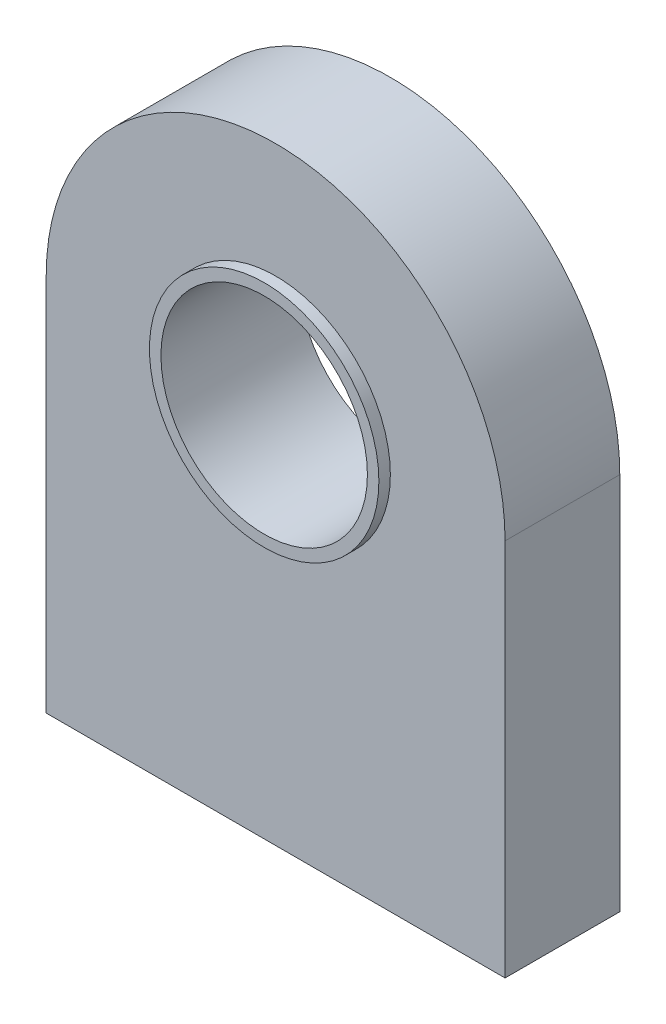
ISO-10303-21;
HEADER;
FILE_DESCRIPTION(('STEP AP214'),'2;1');
FILE_NAME('part.step','',(''),(''),'','','');
FILE_SCHEMA(('AUTOMOTIVE_DESIGN { 1 0 10303 214 1 1 1 1 }'));
ENDSEC;
DATA;
#1=APPLICATION_CONTEXT('core data for automotive mechanical design processes');
#2=APPLICATION_PROTOCOL_DEFINITION('international standard','automotive_design',2000,#1);
#3=PRODUCT_CONTEXT('',#1,'mechanical');
#4=PRODUCT('Part','Part','',(#3));
#5=PRODUCT_RELATED_PRODUCT_CATEGORY('part','',(#4));
#6=PRODUCT_DEFINITION_FORMATION('','',#4);
#7=PRODUCT_DEFINITION_CONTEXT('part definition',#1,'design');
#8=PRODUCT_DEFINITION('design','',#6,#7);
#9=PRODUCT_DEFINITION_SHAPE('','',#8);
#10=(LENGTH_UNIT() NAMED_UNIT(*) SI_UNIT(.MILLI.,.METRE.));
#11=(NAMED_UNIT(*) PLANE_ANGLE_UNIT() SI_UNIT($,.RADIAN.));
#12=(NAMED_UNIT(*) SI_UNIT($,.STERADIAN.) SOLID_ANGLE_UNIT());
#13=UNCERTAINTY_MEASURE_WITH_UNIT(LENGTH_MEASURE(1.E-05),#10,'distance_accuracy_value','');
#14=(GEOMETRIC_REPRESENTATION_CONTEXT(3) GLOBAL_UNCERTAINTY_ASSIGNED_CONTEXT((#13)) GLOBAL_UNIT_ASSIGNED_CONTEXT((#10,
#11,#12)) REPRESENTATION_CONTEXT('',''));
#15=CARTESIAN_POINT('',(0.,0.,0.));
#16=DIRECTION('',(0.,0.,1.));
#17=DIRECTION('',(1.,0.,0.));
#18=AXIS2_PLACEMENT_3D('',#15,#16,#17);
#19=CARTESIAN_POINT('',(10.,16.5,5.));
#20=DIRECTION('',(0.,0.,-1.));
#21=DIRECTION('',(-1.,0.,0.));
#22=AXIS2_PLACEMENT_3D('',#19,#20,#21);
#23=PLANE('',#22);
#24=CARTESIAN_POINT('',(10.,16.5,5.));
#25=DIRECTION('',(0.,0.,-1.));
#26=DIRECTION('',(-1.,0.,0.));
#27=AXIS2_PLACEMENT_3D('',#24,#25,#26);
#28=CIRCLE('',#27,5.);
#29=CARTESIAN_POINT('',(5.,16.5,5.));
#30=VERTEX_POINT('',#29);
#31=EDGE_CURVE('E117',#30,#30,#28,.T.);
#32=ORIENTED_EDGE('',*,*,#31,.T.);
#33=EDGE_LOOP('',(#32));
#34=FACE_BOUND('',#33,.T.);
#35=DIRECTION('',(1.,0.,0.));
#36=VECTOR('',#35,1.);
#37=CARTESIAN_POINT('',(20.,0.,5.));
#38=LINE('',#37,#36);
#39=CARTESIAN_POINT('',(0.,0.,5.));
#40=VERTEX_POINT('',#39);
#41=CARTESIAN_POINT('',(20.,0.,5.));
#42=VERTEX_POINT('',#41);
#43=EDGE_CURVE('E95',#40,#42,#38,.T.);
#44=ORIENTED_EDGE('',*,*,#43,.T.);
#45=DIRECTION('',(0.,1.,0.));
#46=VECTOR('',#45,1.);
#47=CARTESIAN_POINT('',(20.,16.5,5.));
#48=LINE('',#47,#46);
#49=CARTESIAN_POINT('',(20.,16.5,5.));
#50=VERTEX_POINT('',#49);
#51=EDGE_CURVE('E91',#42,#50,#48,.T.);
#52=ORIENTED_EDGE('',*,*,#51,.T.);
#53=CARTESIAN_POINT('',(10.,16.5,5.));
#54=DIRECTION('',(0.,0.,1.));
#55=DIRECTION('',(-1.,0.,0.));
#56=AXIS2_PLACEMENT_3D('',#53,#54,#55);
#57=CIRCLE('',#56,10.);
#58=CARTESIAN_POINT('',(0.,16.5,5.));
#59=VERTEX_POINT('',#58);
#60=EDGE_CURVE('E93',#50,#59,#57,.T.);
#61=ORIENTED_EDGE('',*,*,#60,.T.);
#62=DIRECTION('',(0.,-1.,0.));
#63=VECTOR('',#62,1.);
#64=CARTESIAN_POINT('',(0.,0.,5.));
#65=LINE('',#64,#63);
#66=EDGE_CURVE('E60',#59,#40,#65,.T.);
#67=ORIENTED_EDGE('',*,*,#66,.T.);
#68=EDGE_LOOP('',(#44,#52,#61,#67));
#69=FACE_BOUND('',#68,.T.);
#70=ADVANCED_FACE('F42',(#34,#69),#23,.F.);
#71=CARTESIAN_POINT('',(10.,16.5,0.));
#72=DIRECTION('',(0.,0.,-1.));
#73=DIRECTION('',(-1.,0.,0.));
#74=AXIS2_PLACEMENT_3D('',#71,#72,#73);
#75=PLANE('',#74);
#76=CARTESIAN_POINT('',(10.,16.5,0.));
#77=DIRECTION('',(0.,0.,-1.));
#78=DIRECTION('',(-1.,0.,0.));
#79=AXIS2_PLACEMENT_3D('',#76,#77,#78);
#80=CIRCLE('',#79,5.);
#81=CARTESIAN_POINT('',(5.,16.5,0.));
#82=VERTEX_POINT('',#81);
#83=EDGE_CURVE('E11',#82,#82,#80,.T.);
#84=ORIENTED_EDGE('',*,*,#83,.F.);
#85=EDGE_LOOP('',(#84));
#86=FACE_BOUND('',#85,.T.);
#87=DIRECTION('',(1.,0.,0.));
#88=VECTOR('',#87,1.);
#89=CARTESIAN_POINT('',(20.,0.,0.));
#90=LINE('',#89,#88);
#91=CARTESIAN_POINT('',(0.,0.,0.));
#92=VERTEX_POINT('',#91);
#93=CARTESIAN_POINT('',(20.,0.,0.));
#94=VERTEX_POINT('',#93);
#95=EDGE_CURVE('E113',#92,#94,#90,.T.);
#96=ORIENTED_EDGE('',*,*,#95,.F.);
#97=DIRECTION('',(0.,-1.,0.));
#98=VECTOR('',#97,1.);
#99=CARTESIAN_POINT('',(0.,0.,0.));
#100=LINE('',#99,#98);
#101=CARTESIAN_POINT('',(0.,16.5,0.));
#102=VERTEX_POINT('',#101);
#103=EDGE_CURVE('E83',#102,#92,#100,.T.);
#104=ORIENTED_EDGE('',*,*,#103,.F.);
#105=CARTESIAN_POINT('',(10.,16.5,0.));
#106=DIRECTION('',(0.,0.,1.));
#107=DIRECTION('',(-1.,0.,0.));
#108=AXIS2_PLACEMENT_3D('',#105,#106,#107);
#109=CIRCLE('',#108,10.);
#110=CARTESIAN_POINT('',(20.,16.5,0.));
#111=VERTEX_POINT('',#110);
#112=EDGE_CURVE('E77',#111,#102,#109,.T.);
#113=ORIENTED_EDGE('',*,*,#112,.F.);
#114=DIRECTION('',(0.,1.,0.));
#115=VECTOR('',#114,1.);
#116=CARTESIAN_POINT('',(20.,16.5,0.));
#117=LINE('',#116,#115);
#118=EDGE_CURVE('E101',#94,#111,#117,.T.);
#119=ORIENTED_EDGE('',*,*,#118,.F.);
#120=EDGE_LOOP('',(#96,#104,#113,#119));
#121=FACE_BOUND('',#120,.T.);
#122=ADVANCED_FACE('F131',(#86,#121),#75,.T.);
#123=CARTESIAN_POINT('',(20.,0.,5.));
#124=DIRECTION('',(0.,1.,0.));
#125=DIRECTION('',(-1.,0.,0.));
#126=AXIS2_PLACEMENT_3D('',#123,#124,#125);
#127=PLANE('',#126);
#128=ORIENTED_EDGE('',*,*,#95,.T.);
#129=DIRECTION('',(0.,0.,-1.));
#130=VECTOR('',#129,1.);
#131=CARTESIAN_POINT('',(20.,0.,5.));
#132=LINE('',#131,#130);
#133=EDGE_CURVE('E52',#42,#94,#132,.T.);
#134=ORIENTED_EDGE('',*,*,#133,.F.);
#135=ORIENTED_EDGE('',*,*,#43,.F.);
#136=DIRECTION('',(0.,0.,-1.));
#137=VECTOR('',#136,1.);
#138=CARTESIAN_POINT('',(0.,0.,5.));
#139=LINE('',#138,#137);
#140=EDGE_CURVE('E109',#40,#92,#139,.T.);
#141=ORIENTED_EDGE('',*,*,#140,.T.);
#142=EDGE_LOOP('',(#128,#134,#135,#141));
#143=FACE_BOUND('',#142,.T.);
#144=ADVANCED_FACE('F44',(#143),#127,.F.);
#145=CARTESIAN_POINT('',(20.,16.5,5.));
#146=DIRECTION('',(-1.,0.,0.));
#147=DIRECTION('',(0.,0.,1.));
#148=AXIS2_PLACEMENT_3D('',#145,#146,#147);
#149=PLANE('',#148);
#150=ORIENTED_EDGE('',*,*,#118,.T.);
#151=DIRECTION('',(0.,0.,-1.));
#152=VECTOR('',#151,1.);
#153=CARTESIAN_POINT('',(20.,16.5,5.));
#154=LINE('',#153,#152);
#155=EDGE_CURVE('E99',#50,#111,#154,.T.);
#156=ORIENTED_EDGE('',*,*,#155,.F.);
#157=ORIENTED_EDGE('',*,*,#51,.F.);
#158=ORIENTED_EDGE('',*,*,#133,.T.);
#159=EDGE_LOOP('',(#150,#156,#157,#158));
#160=FACE_BOUND('',#159,.T.);
#161=ADVANCED_FACE('F100',(#160),#149,.F.);
#162=CARTESIAN_POINT('',(10.,16.5,5.));
#163=DIRECTION('',(0.,0.,-1.));
#164=DIRECTION('',(-1.,0.,0.));
#165=AXIS2_PLACEMENT_3D('',#162,#163,#164);
#166=CYLINDRICAL_SURFACE('',#165,10.);
#167=ORIENTED_EDGE('',*,*,#112,.T.);
#168=DIRECTION('',(0.,0.,-1.));
#169=VECTOR('',#168,1.);
#170=CARTESIAN_POINT('',(0.,16.5,5.));
#171=LINE('',#170,#169);
#172=EDGE_CURVE('E103',#59,#102,#171,.T.);
#173=ORIENTED_EDGE('',*,*,#172,.F.);
#174=ORIENTED_EDGE('',*,*,#60,.F.);
#175=ORIENTED_EDGE('',*,*,#155,.T.);
#176=EDGE_LOOP('',(#167,#173,#174,#175));
#177=FACE_BOUND('',#176,.T.);
#178=ADVANCED_FACE('F105',(#177),#166,.T.);
#179=CARTESIAN_POINT('',(0.,0.,5.));
#180=DIRECTION('',(1.,0.,0.));
#181=DIRECTION('',(0.,0.,-1.));
#182=AXIS2_PLACEMENT_3D('',#179,#180,#181);
#183=PLANE('',#182);
#184=ORIENTED_EDGE('',*,*,#103,.T.);
#185=ORIENTED_EDGE('',*,*,#140,.F.);
#186=ORIENTED_EDGE('',*,*,#66,.F.);
#187=ORIENTED_EDGE('',*,*,#172,.T.);
#188=EDGE_LOOP('',(#184,#185,#186,#187));
#189=FACE_BOUND('',#188,.T.);
#190=ADVANCED_FACE('F144',(#189),#183,.F.);
#191=CARTESIAN_POINT('',(10.,16.5,-0.5));
#192=DIRECTION('',(0.,0.,1.));
#193=DIRECTION('',(1.,0.,0.));
#194=AXIS2_PLACEMENT_3D('',#191,#192,#193);
#195=CYLINDRICAL_SURFACE('',#194,5.);
#196=ORIENTED_EDGE('',*,*,#83,.T.);
#197=EDGE_LOOP('',(#196));
#198=FACE_BOUND('',#197,.T.);
#199=CARTESIAN_POINT('',(10.,16.5,-0.5));
#200=DIRECTION('',(0.,0.,1.));
#201=DIRECTION('',(1.,0.,0.));
#202=AXIS2_PLACEMENT_3D('',#199,#200,#201);
#203=CIRCLE('',#202,5.);
#204=CARTESIAN_POINT('',(15.,16.5,-0.5));
#205=VERTEX_POINT('',#204);
#206=EDGE_CURVE('E273',#205,#205,#203,.T.);
#207=ORIENTED_EDGE('',*,*,#206,.T.);
#208=EDGE_LOOP('',(#207));
#209=FACE_BOUND('',#208,.T.);
#210=ADVANCED_FACE('F147',(#198,#209),#195,.T.);
#211=CARTESIAN_POINT('',(10.,16.5,-0.5));
#212=DIRECTION('',(0.,0.,1.));
#213=DIRECTION('',(1.,0.,0.));
#214=AXIS2_PLACEMENT_3D('',#211,#212,#213);
#215=PLANE('',#214);
#216=CARTESIAN_POINT('',(10.,16.5,-0.5));
#217=DIRECTION('',(0.,0.,1.));
#218=DIRECTION('',(1.,0.,0.));
#219=AXIS2_PLACEMENT_3D('',#216,#217,#218);
#220=CIRCLE('',#219,4.5);
#221=CARTESIAN_POINT('',(14.5,16.5,-0.5));
#222=VERTEX_POINT('',#221);
#223=EDGE_CURVE('E267',#222,#222,#220,.T.);
#224=ORIENTED_EDGE('',*,*,#223,.T.);
#225=EDGE_LOOP('',(#224));
#226=FACE_BOUND('',#225,.T.);
#227=ORIENTED_EDGE('',*,*,#206,.F.);
#228=EDGE_LOOP('',(#227));
#229=FACE_BOUND('',#228,.T.);
#230=ADVANCED_FACE('F169',(#226,#229),#215,.F.);
#231=CARTESIAN_POINT('',(10.,16.5,5.));
#232=DIRECTION('',(0.,0.,-1.));
#233=DIRECTION('',(-1.,0.,0.));
#234=AXIS2_PLACEMENT_3D('',#231,#232,#233);
#235=CYLINDRICAL_SURFACE('',#234,4.50000000000001);
#236=ORIENTED_EDGE('',*,*,#223,.F.);
#237=EDGE_LOOP('',(#236));
#238=FACE_BOUND('',#237,.T.);
#239=CARTESIAN_POINT('',(10.,16.5,5.5));
#240=DIRECTION('',(0.,0.,1.));
#241=DIRECTION('',(1.,0.,0.));
#242=AXIS2_PLACEMENT_3D('',#239,#240,#241);
#243=CIRCLE('',#242,4.5);
#244=CARTESIAN_POINT('',(14.5,16.5,5.5));
#245=VERTEX_POINT('',#244);
#246=EDGE_CURVE('E262',#245,#245,#243,.T.);
#247=ORIENTED_EDGE('',*,*,#246,.T.);
#248=EDGE_LOOP('',(#247));
#249=FACE_BOUND('',#248,.T.);
#250=ADVANCED_FACE('F178',(#238,#249),#235,.F.);
#251=CARTESIAN_POINT('',(10.,16.5,5.5));
#252=DIRECTION('',(0.,0.,1.));
#253=DIRECTION('',(1.,0.,0.));
#254=AXIS2_PLACEMENT_3D('',#251,#252,#253);
#255=CIRCLE('',#254,5.);
#256=CARTESIAN_POINT('',(15.,16.5,5.5));
#257=VERTEX_POINT('',#256);
#258=EDGE_CURVE('E259',#257,#257,#255,.T.);
#259=ORIENTED_EDGE('',*,*,#258,.F.);
#260=EDGE_LOOP('',(#259));
#261=FACE_BOUND('',#260,.T.);
#262=ORIENTED_EDGE('',*,*,#31,.F.);
#263=EDGE_LOOP('',(#262));
#264=FACE_BOUND('',#263,.T.);
#265=ADVANCED_FACE('F172',(#261,#264),#195,.T.);
#266=CARTESIAN_POINT('',(10.,16.5,5.5));
#267=DIRECTION('',(0.,0.,1.));
#268=DIRECTION('',(1.,0.,0.));
#269=AXIS2_PLACEMENT_3D('',#266,#267,#268);
#270=PLANE('',#269);
#271=ORIENTED_EDGE('',*,*,#258,.T.);
#272=EDGE_LOOP('',(#271));
#273=FACE_BOUND('',#272,.T.);
#274=ORIENTED_EDGE('',*,*,#246,.F.);
#275=EDGE_LOOP('',(#274));
#276=FACE_BOUND('',#275,.T.);
#277=ADVANCED_FACE('F192',(#273,#276),#270,.T.);
#278=CLOSED_SHELL('',(#70,#122,#144,#161,#178,#190,#210,#230,#250,#265,#277));
#279=MANIFOLD_SOLID_BREP('B2',#278);
#280=ADVANCED_BREP_SHAPE_REPRESENTATION('',(#18,#279),#14);
#281=SHAPE_DEFINITION_REPRESENTATION(#9,#280);
ENDSEC;
END-ISO-10303-21;
